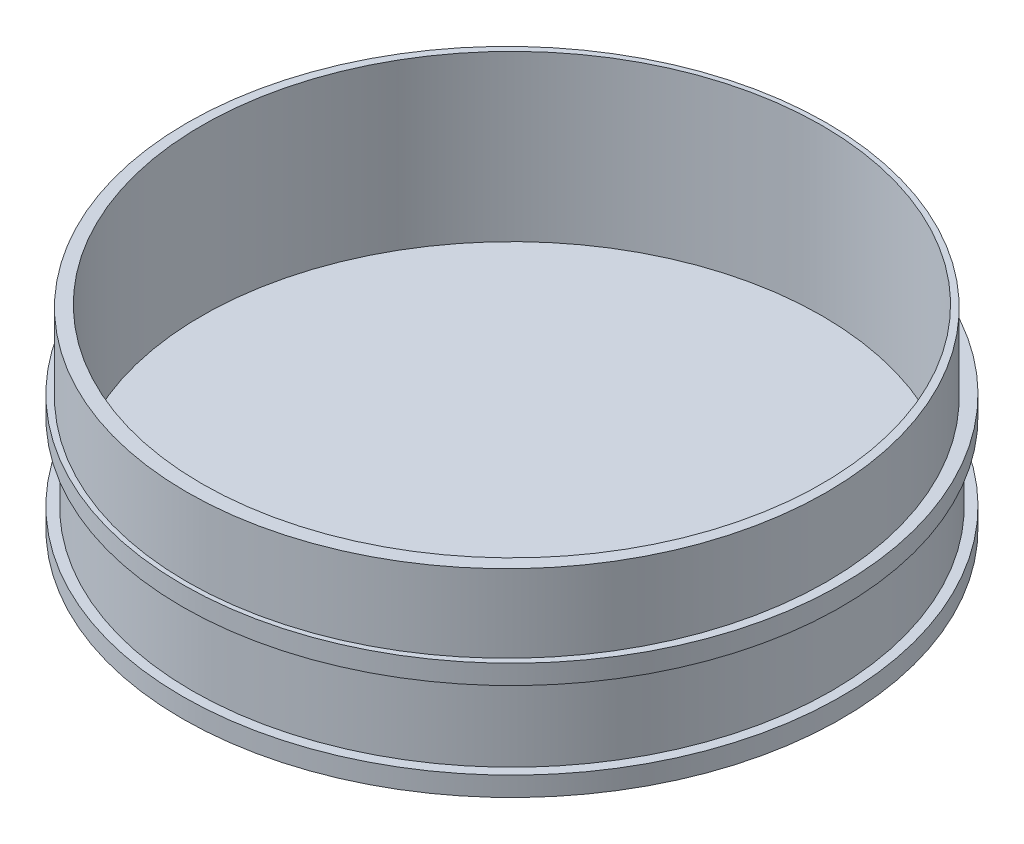
ISO-10303-21;
HEADER;
FILE_DESCRIPTION(('STEP AP214'),'2;1');
FILE_NAME('part.step','',(''),(''),'','','');
FILE_SCHEMA(('AUTOMOTIVE_DESIGN { 1 0 10303 214 1 1 1 1 }'));
ENDSEC;
DATA;
#1=APPLICATION_CONTEXT('core data for automotive mechanical design processes');
#2=APPLICATION_PROTOCOL_DEFINITION('international standard','automotive_design',2000,#1);
#3=PRODUCT_CONTEXT('',#1,'mechanical');
#4=PRODUCT('Part','Part','',(#3));
#5=PRODUCT_RELATED_PRODUCT_CATEGORY('part','',(#4));
#6=PRODUCT_DEFINITION_FORMATION('','',#4);
#7=PRODUCT_DEFINITION_CONTEXT('part definition',#1,'design');
#8=PRODUCT_DEFINITION('design','',#6,#7);
#9=PRODUCT_DEFINITION_SHAPE('','',#8);
#10=(LENGTH_UNIT() NAMED_UNIT(*) SI_UNIT(.MILLI.,.METRE.));
#11=(NAMED_UNIT(*) PLANE_ANGLE_UNIT() SI_UNIT($,.RADIAN.));
#12=(NAMED_UNIT(*) SI_UNIT($,.STERADIAN.) SOLID_ANGLE_UNIT());
#13=UNCERTAINTY_MEASURE_WITH_UNIT(LENGTH_MEASURE(1.E-05),#10,'distance_accuracy_value','');
#14=(GEOMETRIC_REPRESENTATION_CONTEXT(3) GLOBAL_UNCERTAINTY_ASSIGNED_CONTEXT((#13)) GLOBAL_UNIT_ASSIGNED_CONTEXT((#10,
#11,#12)) REPRESENTATION_CONTEXT('',''));
#15=CARTESIAN_POINT('',(0.,0.,0.));
#16=DIRECTION('',(0.,0.,1.));
#17=DIRECTION('',(1.,0.,0.));
#18=AXIS2_PLACEMENT_3D('',#15,#16,#17);
#19=CARTESIAN_POINT('',(0.,1.,0.));
#20=DIRECTION('',(0.,-1.,0.));
#21=DIRECTION('',(0.,0.,-1.));
#22=AXIS2_PLACEMENT_3D('',#19,#20,#21);
#23=CYLINDRICAL_SURFACE('',#22,17.);
#24=CARTESIAN_POINT('',(0.,1.,0.));
#25=DIRECTION('',(0.,1.,0.));
#26=DIRECTION('',(0.,0.,1.));
#27=AXIS2_PLACEMENT_3D('',#24,#25,#26);
#28=CIRCLE('',#27,17.);
#29=CARTESIAN_POINT('',(0.,1.,17.));
#30=VERTEX_POINT('',#29);
#31=EDGE_CURVE('E57',#30,#30,#28,.T.);
#32=ORIENTED_EDGE('',*,*,#31,.F.);
#33=EDGE_LOOP('',(#32));
#34=FACE_BOUND('',#33,.T.);
#35=CARTESIAN_POINT('',(0.,0.,0.));
#36=DIRECTION('',(0.,1.,0.));
#37=DIRECTION('',(0.,0.,1.));
#38=AXIS2_PLACEMENT_3D('',#35,#36,#37);
#39=CIRCLE('',#38,17.);
#40=CARTESIAN_POINT('',(0.,0.,17.));
#41=VERTEX_POINT('',#40);
#42=EDGE_CURVE('E46',#41,#41,#39,.T.);
#43=ORIENTED_EDGE('',*,*,#42,.T.);
#44=EDGE_LOOP('',(#43));
#45=FACE_BOUND('',#44,.T.);
#46=ADVANCED_FACE('F43',(#34,#45),#23,.T.);
#47=CARTESIAN_POINT('',(0.,1.,0.));
#48=DIRECTION('',(0.,1.,0.));
#49=DIRECTION('',(0.,0.,1.));
#50=AXIS2_PLACEMENT_3D('',#47,#48,#49);
#51=PLANE('',#50);
#52=CARTESIAN_POINT('',(0.,1.,0.));
#53=DIRECTION('',(0.,1.,0.));
#54=DIRECTION('',(0.,0.,1.));
#55=AXIS2_PLACEMENT_3D('',#52,#53,#54);
#56=CIRCLE('',#55,16.5);
#57=CARTESIAN_POINT('',(0.,1.,16.5));
#58=VERTEX_POINT('',#57);
#59=EDGE_CURVE('E51',#58,#58,#56,.T.);
#60=ORIENTED_EDGE('',*,*,#59,.F.);
#61=EDGE_LOOP('',(#60));
#62=FACE_BOUND('',#61,.T.);
#63=ORIENTED_EDGE('',*,*,#31,.T.);
#64=EDGE_LOOP('',(#63));
#65=FACE_BOUND('',#64,.T.);
#66=ADVANCED_FACE('F86',(#62,#65),#51,.T.);
#67=CARTESIAN_POINT('',(0.,0.,0.));
#68=DIRECTION('',(0.,1.,0.));
#69=DIRECTION('',(0.,0.,1.));
#70=AXIS2_PLACEMENT_3D('',#67,#68,#69);
#71=PLANE('',#70);
#72=ORIENTED_EDGE('',*,*,#42,.F.);
#73=EDGE_LOOP('',(#72));
#74=FACE_BOUND('',#73,.T.);
#75=ADVANCED_FACE('F83',(#74),#71,.F.);
#76=CARTESIAN_POINT('',(0.,5.,0.));
#77=DIRECTION('',(0.,-1.,0.));
#78=DIRECTION('',(0.,0.,-1.));
#79=AXIS2_PLACEMENT_3D('',#76,#77,#78);
#80=CYLINDRICAL_SURFACE('',#79,16.5);
#81=CARTESIAN_POINT('',(0.,5.,0.));
#82=DIRECTION('',(0.,1.,0.));
#83=DIRECTION('',(0.,0.,1.));
#84=AXIS2_PLACEMENT_3D('',#81,#82,#83);
#85=CIRCLE('',#84,16.5);
#86=CARTESIAN_POINT('',(0.,5.,16.5));
#87=VERTEX_POINT('',#86);
#88=EDGE_CURVE('E67',#87,#87,#85,.T.);
#89=ORIENTED_EDGE('',*,*,#88,.F.);
#90=EDGE_LOOP('',(#89));
#91=FACE_BOUND('',#90,.T.);
#92=ORIENTED_EDGE('',*,*,#59,.T.);
#93=EDGE_LOOP('',(#92));
#94=FACE_BOUND('',#93,.T.);
#95=ADVANCED_FACE('F85',(#91,#94),#80,.T.);
#96=CARTESIAN_POINT('',(0.,6.,0.));
#97=DIRECTION('',(0.,-1.,0.));
#98=DIRECTION('',(0.,0.,-1.));
#99=AXIS2_PLACEMENT_3D('',#96,#97,#98);
#100=CYLINDRICAL_SURFACE('',#99,17.);
#101=CARTESIAN_POINT('',(0.,6.,0.));
#102=DIRECTION('',(0.,1.,0.));
#103=DIRECTION('',(0.,0.,1.));
#104=AXIS2_PLACEMENT_3D('',#101,#102,#103);
#105=CIRCLE('',#104,17.);
#106=CARTESIAN_POINT('',(0.,6.,17.));
#107=VERTEX_POINT('',#106);
#108=EDGE_CURVE('E63',#107,#107,#105,.T.);
#109=ORIENTED_EDGE('',*,*,#108,.F.);
#110=EDGE_LOOP('',(#109));
#111=FACE_BOUND('',#110,.T.);
#112=CARTESIAN_POINT('',(0.,5.,0.));
#113=DIRECTION('',(0.,1.,0.));
#114=DIRECTION('',(0.,0.,1.));
#115=AXIS2_PLACEMENT_3D('',#112,#113,#114);
#116=CIRCLE('',#115,17.);
#117=CARTESIAN_POINT('',(0.,5.,17.));
#118=VERTEX_POINT('',#117);
#119=EDGE_CURVE('E68',#118,#118,#116,.T.);
#120=ORIENTED_EDGE('',*,*,#119,.T.);
#121=EDGE_LOOP('',(#120));
#122=FACE_BOUND('',#121,.T.);
#123=ADVANCED_FACE('F92',(#111,#122),#100,.T.);
#124=CARTESIAN_POINT('',(0.,6.,0.));
#125=DIRECTION('',(0.,1.,0.));
#126=DIRECTION('',(0.,0.,1.));
#127=AXIS2_PLACEMENT_3D('',#124,#125,#126);
#128=PLANE('',#127);
#129=CARTESIAN_POINT('',(0.,6.,0.263172859168045));
#130=DIRECTION('',(0.,1.,0.));
#131=DIRECTION('',(0.,0.,1.));
#132=AXIS2_PLACEMENT_3D('',#129,#130,#131);
#133=CIRCLE('',#132,16.5);
#134=CARTESIAN_POINT('',(0.,6.,16.763172859168));
#135=VERTEX_POINT('',#134);
#136=EDGE_CURVE('E10',#135,#135,#133,.T.);
#137=ORIENTED_EDGE('',*,*,#136,.F.);
#138=EDGE_LOOP('',(#137));
#139=FACE_BOUND('',#138,.T.);
#140=ORIENTED_EDGE('',*,*,#108,.T.);
#141=EDGE_LOOP('',(#140));
#142=FACE_BOUND('',#141,.T.);
#143=ADVANCED_FACE('F126',(#139,#142),#128,.T.);
#144=CARTESIAN_POINT('',(0.,5.,0.));
#145=DIRECTION('',(0.,1.,0.));
#146=DIRECTION('',(0.,0.,1.));
#147=AXIS2_PLACEMENT_3D('',#144,#145,#146);
#148=PLANE('',#147);
#149=ORIENTED_EDGE('',*,*,#88,.T.);
#150=EDGE_LOOP('',(#149));
#151=FACE_BOUND('',#150,.T.);
#152=ORIENTED_EDGE('',*,*,#119,.F.);
#153=EDGE_LOOP('',(#152));
#154=FACE_BOUND('',#153,.T.);
#155=ADVANCED_FACE('F137',(#151,#154),#148,.F.);
#156=CARTESIAN_POINT('',(0.,10.,0.263172859168045));
#157=DIRECTION('',(0.,-1.,0.));
#158=DIRECTION('',(0.,0.,-1.));
#159=AXIS2_PLACEMENT_3D('',#156,#157,#158);
#160=CYLINDRICAL_SURFACE('',#159,16.5);
#161=CARTESIAN_POINT('',(0.,10.,0.263172859168045));
#162=DIRECTION('',(0.,1.,0.));
#163=DIRECTION('',(0.,0.,1.));
#164=AXIS2_PLACEMENT_3D('',#161,#162,#163);
#165=CIRCLE('',#164,16.5);
#166=CARTESIAN_POINT('',(0.,10.,16.763172859168));
#167=VERTEX_POINT('',#166);
#168=EDGE_CURVE('E61',#167,#167,#165,.T.);
#169=ORIENTED_EDGE('',*,*,#168,.F.);
#170=EDGE_LOOP('',(#169));
#171=FACE_BOUND('',#170,.T.);
#172=ORIENTED_EDGE('',*,*,#136,.T.);
#173=EDGE_LOOP('',(#172));
#174=FACE_BOUND('',#173,.T.);
#175=ADVANCED_FACE('F147',(#171,#174),#160,.T.);
#176=CARTESIAN_POINT('',(0.,10.,0.263172859168045));
#177=DIRECTION('',(0.,1.,0.));
#178=DIRECTION('',(0.,0.,1.));
#179=AXIS2_PLACEMENT_3D('',#176,#177,#178);
#180=PLANE('',#179);
#181=CARTESIAN_POINT('',(0.,10.,0.));
#182=DIRECTION('',(0.,1.,0.));
#183=DIRECTION('',(0.,0.,1.));
#184=AXIS2_PLACEMENT_3D('',#181,#182,#183);
#185=CIRCLE('',#184,16.);
#186=CARTESIAN_POINT('',(0.,10.,16.));
#187=VERTEX_POINT('',#186);
#188=EDGE_CURVE('E193',#187,#187,#185,.T.);
#189=ORIENTED_EDGE('',*,*,#188,.F.);
#190=EDGE_LOOP('',(#189));
#191=FACE_BOUND('',#190,.T.);
#192=ORIENTED_EDGE('',*,*,#168,.T.);
#193=EDGE_LOOP('',(#192));
#194=FACE_BOUND('',#193,.T.);
#195=ADVANCED_FACE('F156',(#191,#194),#180,.T.);
#196=CARTESIAN_POINT('',(0.,1.5,0.));
#197=DIRECTION('',(0.,1.,0.));
#198=DIRECTION('',(0.,0.,1.));
#199=AXIS2_PLACEMENT_3D('',#196,#197,#198);
#200=CYLINDRICAL_SURFACE('',#199,16.);
#201=CARTESIAN_POINT('',(0.,1.5,0.));
#202=DIRECTION('',(0.,1.,0.));
#203=DIRECTION('',(0.,0.,1.));
#204=AXIS2_PLACEMENT_3D('',#201,#202,#203);
#205=CIRCLE('',#204,16.);
#206=CARTESIAN_POINT('',(0.,1.5,16.));
#207=VERTEX_POINT('',#206);
#208=EDGE_CURVE('E191',#207,#207,#205,.T.);
#209=ORIENTED_EDGE('',*,*,#208,.F.);
#210=EDGE_LOOP('',(#209));
#211=FACE_BOUND('',#210,.T.);
#212=ORIENTED_EDGE('',*,*,#188,.T.);
#213=EDGE_LOOP('',(#212));
#214=FACE_BOUND('',#213,.T.);
#215=ADVANCED_FACE('F166',(#211,#214),#200,.F.);
#216=CARTESIAN_POINT('',(0.,1.5,0.));
#217=DIRECTION('',(0.,1.,0.));
#218=DIRECTION('',(0.,0.,1.));
#219=AXIS2_PLACEMENT_3D('',#216,#217,#218);
#220=PLANE('',#219);
#221=ORIENTED_EDGE('',*,*,#208,.T.);
#222=EDGE_LOOP('',(#221));
#223=FACE_BOUND('',#222,.T.);
#224=ADVANCED_FACE('F176',(#223),#220,.T.);
#225=CLOSED_SHELL('',(#46,#66,#75,#95,#123,#143,#155,#175,#195,#215,#224));
#226=MANIFOLD_SOLID_BREP('B2',#225);
#227=ADVANCED_BREP_SHAPE_REPRESENTATION('',(#18,#226),#14);
#228=SHAPE_DEFINITION_REPRESENTATION(#9,#227);
ENDSEC;
END-ISO-10303-21;
